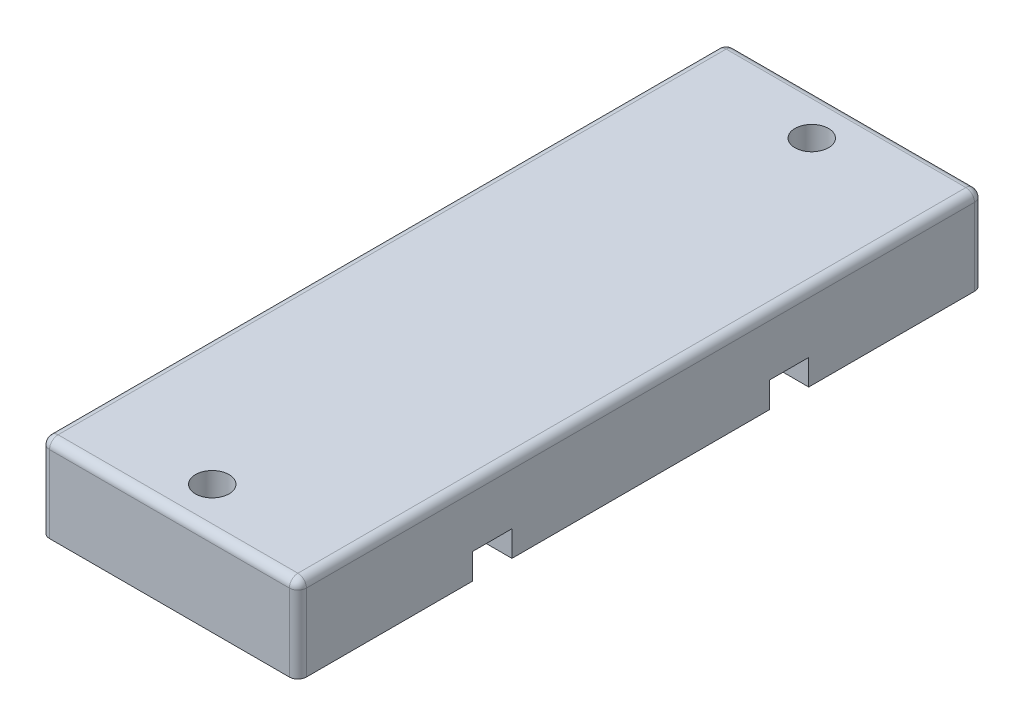
ISO-10303-21;
HEADER;
FILE_DESCRIPTION(('STEP AP214'),'2;1');
FILE_NAME('part.step','',(''),(''),'','','');
FILE_SCHEMA(('AUTOMOTIVE_DESIGN { 1 0 10303 214 1 1 1 1 }'));
ENDSEC;
DATA;
#1=APPLICATION_CONTEXT('core data for automotive mechanical design processes');
#2=APPLICATION_PROTOCOL_DEFINITION('international standard','automotive_design',2000,#1);
#3=PRODUCT_CONTEXT('',#1,'mechanical');
#4=PRODUCT('Part','Part','',(#3));
#5=PRODUCT_RELATED_PRODUCT_CATEGORY('part','',(#4));
#6=PRODUCT_DEFINITION_FORMATION('','',#4);
#7=PRODUCT_DEFINITION_CONTEXT('part definition',#1,'design');
#8=PRODUCT_DEFINITION('design','',#6,#7);
#9=PRODUCT_DEFINITION_SHAPE('','',#8);
#10=(LENGTH_UNIT() NAMED_UNIT(*) SI_UNIT(.MILLI.,.METRE.));
#11=(NAMED_UNIT(*) PLANE_ANGLE_UNIT() SI_UNIT($,.RADIAN.));
#12=(NAMED_UNIT(*) SI_UNIT($,.STERADIAN.) SOLID_ANGLE_UNIT());
#13=UNCERTAINTY_MEASURE_WITH_UNIT(LENGTH_MEASURE(1.E-05),#10,'distance_accuracy_value','');
#14=(GEOMETRIC_REPRESENTATION_CONTEXT(3) GLOBAL_UNCERTAINTY_ASSIGNED_CONTEXT((#13)) GLOBAL_UNIT_ASSIGNED_CONTEXT((#10,
#11,#12)) REPRESENTATION_CONTEXT('',''));
#15=CARTESIAN_POINT('',(0.,0.,0.));
#16=DIRECTION('',(0.,0.,1.));
#17=DIRECTION('',(1.,0.,0.));
#18=AXIS2_PLACEMENT_3D('',#15,#16,#17);
#19=CARTESIAN_POINT('',(0.,0.,0.));
#20=DIRECTION('',(0.,-1.,0.));
#21=DIRECTION('',(0.,0.,-1.));
#22=AXIS2_PLACEMENT_3D('',#19,#20,#21);
#23=PLANE('',#22);
#24=CARTESIAN_POINT('',(19.05,0.,-95.25));
#25=DIRECTION('',(0.,1.,0.));
#26=DIRECTION('',(0.,0.,1.));
#27=AXIS2_PLACEMENT_3D('',#24,#25,#26);
#28=CIRCLE('',#27,2.4892);
#29=CARTESIAN_POINT('',(19.05,0.,-92.7608));
#30=VERTEX_POINT('',#29);
#31=EDGE_CURVE('E482',#30,#30,#28,.T.);
#32=ORIENTED_EDGE('',*,*,#31,.T.);
#33=EDGE_LOOP('',(#32));
#34=FACE_BOUND('',#33,.T.);
#35=DIRECTION('',(-1.,0.,0.));
#36=VECTOR('',#35,1.);
#37=CARTESIAN_POINT('',(0.,0.,-101.6));
#38=LINE('',#37,#36);
#39=CARTESIAN_POINT('',(36.83,0.,-101.6));
#40=VERTEX_POINT('',#39);
#41=CARTESIAN_POINT('',(1.26999999999999,0.,-101.6));
#42=VERTEX_POINT('',#41);
#43=EDGE_CURVE('E265',#40,#42,#38,.T.);
#44=ORIENTED_EDGE('',*,*,#43,.F.);
#45=CARTESIAN_POINT('',(36.83,0.,-100.33));
#46=DIRECTION('',(0.,-1.,0.));
#47=DIRECTION('',(0.,0.,-1.));
#48=AXIS2_PLACEMENT_3D('',#45,#46,#47);
#49=CIRCLE('',#48,1.27);
#50=CARTESIAN_POINT('',(38.1,0.,-100.33));
#51=VERTEX_POINT('',#50);
#52=EDGE_CURVE('E287',#40,#51,#49,.T.);
#53=ORIENTED_EDGE('',*,*,#52,.T.);
#54=DIRECTION('',(0.,0.,-1.));
#55=VECTOR('',#54,1.);
#56=CARTESIAN_POINT('',(38.1,0.,-101.6));
#57=LINE('',#56,#55);
#58=CARTESIAN_POINT('',(38.1,0.,-75.753849));
#59=VERTEX_POINT('',#58);
#60=EDGE_CURVE('E261',#59,#51,#57,.T.);
#61=ORIENTED_EDGE('',*,*,#60,.F.);
#62=DIRECTION('',(-1.,0.,0.));
#63=VECTOR('',#62,1.);
#64=CARTESIAN_POINT('',(38.1,0.,-75.753849));
#65=LINE('',#64,#63);
#66=CARTESIAN_POINT('',(0.,0.,-75.753849));
#67=VERTEX_POINT('',#66);
#68=EDGE_CURVE('E215',#59,#67,#65,.T.);
#69=ORIENTED_EDGE('',*,*,#68,.T.);
#70=DIRECTION('',(0.,0.,1.));
#71=VECTOR('',#70,1.);
#72=CARTESIAN_POINT('',(0.,0.,0.));
#73=LINE('',#72,#71);
#74=CARTESIAN_POINT('',(0.,0.,-100.33));
#75=VERTEX_POINT('',#74);
#76=EDGE_CURVE('E270',#75,#67,#73,.T.);
#77=ORIENTED_EDGE('',*,*,#76,.F.);
#78=CARTESIAN_POINT('',(1.26999999999999,0.,-100.33));
#79=DIRECTION('',(0.,-1.,0.));
#80=DIRECTION('',(0.,0.,-1.));
#81=AXIS2_PLACEMENT_3D('',#78,#79,#80);
#82=CIRCLE('',#81,1.27);
#83=EDGE_CURVE('E284',#75,#42,#82,.T.);
#84=ORIENTED_EDGE('',*,*,#83,.T.);
#85=EDGE_LOOP('',(#44,#53,#61,#69,#77,#84));
#86=FACE_BOUND('',#85,.T.);
#87=ADVANCED_FACE('F43',(#34,#86),#23,.T.);
#88=DIRECTION('',(-1.,0.,0.));
#89=VECTOR('',#88,1.);
#90=CARTESIAN_POINT('',(38.1,0.,-69.9155828));
#91=LINE('',#90,#89);
#92=CARTESIAN_POINT('',(38.1,0.,-69.9155828));
#93=VERTEX_POINT('',#92);
#94=CARTESIAN_POINT('',(0.,0.,-69.9155828));
#95=VERTEX_POINT('',#94);
#96=EDGE_CURVE('E180',#93,#95,#91,.T.);
#97=ORIENTED_EDGE('',*,*,#96,.F.);
#98=CARTESIAN_POINT('',(38.1,0.,-31.7410338));
#99=VERTEX_POINT('',#98);
#100=EDGE_CURVE('E196',#99,#93,#57,.T.);
#101=ORIENTED_EDGE('',*,*,#100,.F.);
#102=DIRECTION('',(-1.,0.,0.));
#103=VECTOR('',#102,1.);
#104=CARTESIAN_POINT('',(38.1,0.,-31.7410338));
#105=LINE('',#104,#103);
#106=CARTESIAN_POINT('',(0.,0.,-31.7410338));
#107=VERTEX_POINT('',#106);
#108=EDGE_CURVE('E234',#99,#107,#105,.T.);
#109=ORIENTED_EDGE('',*,*,#108,.T.);
#110=EDGE_CURVE('E274',#95,#107,#73,.T.);
#111=ORIENTED_EDGE('',*,*,#110,.F.);
#112=EDGE_LOOP('',(#97,#101,#109,#111));
#113=FACE_BOUND('',#112,.T.);
#114=ADVANCED_FACE('F455',(#113),#23,.T.);
#115=CARTESIAN_POINT('',(38.1,12.7,0.));
#116=DIRECTION('',(0.,0.,-1.));
#117=DIRECTION('',(-1.,0.,0.));
#118=AXIS2_PLACEMENT_3D('',#115,#116,#117);
#119=PLANE('',#118);
#120=DIRECTION('',(1.,0.,0.));
#121=VECTOR('',#120,1.);
#122=CARTESIAN_POINT('',(38.1,0.,0.));
#123=LINE('',#122,#121);
#124=CARTESIAN_POINT('',(1.27,0.,0.));
#125=VERTEX_POINT('',#124);
#126=CARTESIAN_POINT('',(36.83,0.,0.));
#127=VERTEX_POINT('',#126);
#128=EDGE_CURVE('E219',#125,#127,#123,.T.);
#129=ORIENTED_EDGE('',*,*,#128,.T.);
#130=DIRECTION('',(0.,-1.,0.));
#131=VECTOR('',#130,1.);
#132=CARTESIAN_POINT('',(36.83,12.7,0.));
#133=LINE('',#132,#131);
#134=CARTESIAN_POINT('',(36.83,11.43,0.));
#135=VERTEX_POINT('',#134);
#136=EDGE_CURVE('E324',#127,#135,#133,.F.);
#137=ORIENTED_EDGE('',*,*,#136,.T.);
#138=DIRECTION('',(1.,0.,0.));
#139=VECTOR('',#138,1.);
#140=CARTESIAN_POINT('',(38.1,11.43,0.));
#141=LINE('',#140,#139);
#142=CARTESIAN_POINT('',(1.27,11.43,0.));
#143=VERTEX_POINT('',#142);
#144=EDGE_CURVE('E321',#135,#143,#141,.F.);
#145=ORIENTED_EDGE('',*,*,#144,.T.);
#146=DIRECTION('',(0.,-1.,0.));
#147=VECTOR('',#146,1.);
#148=CARTESIAN_POINT('',(1.27,12.7,0.));
#149=LINE('',#148,#147);
#150=EDGE_CURVE('E318',#143,#125,#149,.T.);
#151=ORIENTED_EDGE('',*,*,#150,.T.);
#152=EDGE_LOOP('',(#129,#137,#145,#151));
#153=FACE_BOUND('',#152,.T.);
#154=ADVANCED_FACE('F387',(#153),#119,.F.);
#155=CARTESIAN_POINT('',(38.1,12.7,-101.6));
#156=DIRECTION('',(-1.,0.,0.));
#157=DIRECTION('',(0.,0.,1.));
#158=AXIS2_PLACEMENT_3D('',#155,#156,#157);
#159=PLANE('',#158);
#160=ORIENTED_EDGE('',*,*,#60,.T.);
#161=DIRECTION('',(0.,-1.,0.));
#162=VECTOR('',#161,1.);
#163=CARTESIAN_POINT('',(38.1,12.7,-100.33));
#164=LINE('',#163,#162);
#165=CARTESIAN_POINT('',(38.1,11.43,-100.33));
#166=VERTEX_POINT('',#165);
#167=EDGE_CURVE('E296',#51,#166,#164,.F.);
#168=ORIENTED_EDGE('',*,*,#167,.T.);
#169=DIRECTION('',(0.,0.,-1.));
#170=VECTOR('',#169,1.);
#171=CARTESIAN_POINT('',(38.1,11.43,-101.6));
#172=LINE('',#171,#170);
#173=CARTESIAN_POINT('',(38.1,11.43,-1.27000000000001));
#174=VERTEX_POINT('',#173);
#175=EDGE_CURVE('E293',#166,#174,#172,.F.);
#176=ORIENTED_EDGE('',*,*,#175,.T.);
#177=DIRECTION('',(0.,-1.,0.));
#178=VECTOR('',#177,1.);
#179=CARTESIAN_POINT('',(38.1,12.7,-1.27000000000001));
#180=LINE('',#179,#178);
#181=CARTESIAN_POINT('',(38.1,0.,-1.27000000000001));
#182=VERTEX_POINT('',#181);
#183=EDGE_CURVE('E290',#174,#182,#180,.T.);
#184=ORIENTED_EDGE('',*,*,#183,.T.);
#185=CARTESIAN_POINT('',(38.1,0.,-25.9027676));
#186=VERTEX_POINT('',#185);
#187=EDGE_CURVE('E262',#182,#186,#57,.T.);
#188=ORIENTED_EDGE('',*,*,#187,.T.);
#189=DIRECTION('',(0.,1.,0.));
#190=VECTOR('',#189,1.);
#191=CARTESIAN_POINT('',(38.1,3.81,-25.9027676));
#192=LINE('',#191,#190);
#193=CARTESIAN_POINT('',(38.1,3.81,-25.9027676));
#194=VERTEX_POINT('',#193);
#195=EDGE_CURVE('E242',#186,#194,#192,.T.);
#196=ORIENTED_EDGE('',*,*,#195,.T.);
#197=DIRECTION('',(0.,0.,-1.));
#198=VECTOR('',#197,1.);
#199=CARTESIAN_POINT('',(38.1,3.81,-31.7410338));
#200=LINE('',#199,#198);
#201=CARTESIAN_POINT('',(38.1,3.81,-31.7410338));
#202=VERTEX_POINT('',#201);
#203=EDGE_CURVE('E251',#194,#202,#200,.T.);
#204=ORIENTED_EDGE('',*,*,#203,.T.);
#205=DIRECTION('',(0.,-1.,0.));
#206=VECTOR('',#205,1.);
#207=CARTESIAN_POINT('',(38.1,0.,-31.7410338));
#208=LINE('',#207,#206);
#209=EDGE_CURVE('E227',#202,#99,#208,.T.);
#210=ORIENTED_EDGE('',*,*,#209,.T.);
#211=ORIENTED_EDGE('',*,*,#100,.T.);
#212=DIRECTION('',(0.,1.,0.));
#213=VECTOR('',#212,1.);
#214=CARTESIAN_POINT('',(38.1,3.81,-69.9155828));
#215=LINE('',#214,#213);
#216=CARTESIAN_POINT('',(38.1,3.81,-69.9155828));
#217=VERTEX_POINT('',#216);
#218=EDGE_CURVE('E171',#93,#217,#215,.T.);
#219=ORIENTED_EDGE('',*,*,#218,.T.);
#220=DIRECTION('',(0.,0.,-1.));
#221=VECTOR('',#220,1.);
#222=CARTESIAN_POINT('',(38.1,3.81,-75.753849));
#223=LINE('',#222,#221);
#224=CARTESIAN_POINT('',(38.1,3.81,-75.753849));
#225=VERTEX_POINT('',#224);
#226=EDGE_CURVE('E183',#217,#225,#223,.T.);
#227=ORIENTED_EDGE('',*,*,#226,.T.);
#228=DIRECTION('',(0.,-1.,0.));
#229=VECTOR('',#228,1.);
#230=CARTESIAN_POINT('',(38.1,0.,-75.753849));
#231=LINE('',#230,#229);
#232=EDGE_CURVE('E189',#225,#59,#231,.T.);
#233=ORIENTED_EDGE('',*,*,#232,.T.);
#234=EDGE_LOOP('',(#160,#168,#176,#184,#188,#196,#204,#210,#211,#219,#227,#233));
#235=FACE_BOUND('',#234,.T.);
#236=ADVANCED_FACE('F193',(#235),#159,.F.);
#237=CARTESIAN_POINT('',(0.,12.7,-101.6));
#238=DIRECTION('',(0.,0.,1.));
#239=DIRECTION('',(1.,0.,0.));
#240=AXIS2_PLACEMENT_3D('',#237,#238,#239);
#241=PLANE('',#240);
#242=DIRECTION('',(-1.,0.,0.));
#243=VECTOR('',#242,1.);
#244=CARTESIAN_POINT('',(0.,11.43,-101.6));
#245=LINE('',#244,#243);
#246=CARTESIAN_POINT('',(1.26999999999999,11.43,-101.6));
#247=VERTEX_POINT('',#246);
#248=CARTESIAN_POINT('',(36.83,11.43,-101.6));
#249=VERTEX_POINT('',#248);
#250=EDGE_CURVE('E277',#247,#249,#245,.F.);
#251=ORIENTED_EDGE('',*,*,#250,.T.);
#252=DIRECTION('',(0.,-1.,0.));
#253=VECTOR('',#252,1.);
#254=CARTESIAN_POINT('',(36.83,12.7,-101.6));
#255=LINE('',#254,#253);
#256=EDGE_CURVE('E280',#249,#40,#255,.T.);
#257=ORIENTED_EDGE('',*,*,#256,.T.);
#258=ORIENTED_EDGE('',*,*,#43,.T.);
#259=DIRECTION('',(0.,-1.,0.));
#260=VECTOR('',#259,1.);
#261=CARTESIAN_POINT('',(1.26999999999999,12.7,-101.6));
#262=LINE('',#261,#260);
#263=EDGE_CURVE('E273',#42,#247,#262,.F.);
#264=ORIENTED_EDGE('',*,*,#263,.T.);
#265=EDGE_LOOP('',(#251,#257,#258,#264));
#266=FACE_BOUND('',#265,.T.);
#267=ADVANCED_FACE('F445',(#266),#241,.F.);
#268=CARTESIAN_POINT('',(0.,12.7,0.));
#269=DIRECTION('',(1.,0.,0.));
#270=DIRECTION('',(0.,0.,-1.));
#271=AXIS2_PLACEMENT_3D('',#268,#269,#270);
#272=PLANE('',#271);
#273=CARTESIAN_POINT('',(0.,0.,-25.9027676));
#274=VERTEX_POINT('',#273);
#275=CARTESIAN_POINT('',(0.,0.,-1.27));
#276=VERTEX_POINT('',#275);
#277=EDGE_CURVE('E269',#274,#276,#73,.T.);
#278=ORIENTED_EDGE('',*,*,#277,.T.);
#279=DIRECTION('',(0.,-1.,0.));
#280=VECTOR('',#279,1.);
#281=CARTESIAN_POINT('',(0.,12.7,-1.27));
#282=LINE('',#281,#280);
#283=CARTESIAN_POINT('',(0.,11.43,-1.27));
#284=VERTEX_POINT('',#283);
#285=EDGE_CURVE('E11',#276,#284,#282,.F.);
#286=ORIENTED_EDGE('',*,*,#285,.T.);
#287=DIRECTION('',(0.,0.,1.));
#288=VECTOR('',#287,1.);
#289=CARTESIAN_POINT('',(0.,11.43,0.));
#290=LINE('',#289,#288);
#291=CARTESIAN_POINT('',(0.,11.43,-100.33));
#292=VERTEX_POINT('',#291);
#293=EDGE_CURVE('E53',#284,#292,#290,.F.);
#294=ORIENTED_EDGE('',*,*,#293,.T.);
#295=DIRECTION('',(0.,-1.,0.));
#296=VECTOR('',#295,1.);
#297=CARTESIAN_POINT('',(0.,12.7,-100.33));
#298=LINE('',#297,#296);
#299=EDGE_CURVE('E327',#292,#75,#298,.T.);
#300=ORIENTED_EDGE('',*,*,#299,.T.);
#301=ORIENTED_EDGE('',*,*,#76,.T.);
#302=DIRECTION('',(0.,-1.,0.));
#303=VECTOR('',#302,1.);
#304=CARTESIAN_POINT('',(0.,0.,-75.753849));
#305=LINE('',#304,#303);
#306=CARTESIAN_POINT('',(0.,3.81,-75.753849));
#307=VERTEX_POINT('',#306);
#308=EDGE_CURVE('E198',#307,#67,#305,.T.);
#309=ORIENTED_EDGE('',*,*,#308,.F.);
#310=DIRECTION('',(0.,0.,-1.));
#311=VECTOR('',#310,1.);
#312=CARTESIAN_POINT('',(0.,3.81,-75.753849));
#313=LINE('',#312,#311);
#314=CARTESIAN_POINT('',(0.,3.81,-69.9155828));
#315=VERTEX_POINT('',#314);
#316=EDGE_CURVE('E202',#315,#307,#313,.T.);
#317=ORIENTED_EDGE('',*,*,#316,.F.);
#318=DIRECTION('',(0.,1.,0.));
#319=VECTOR('',#318,1.);
#320=CARTESIAN_POINT('',(0.,3.81,-69.9155828));
#321=LINE('',#320,#319);
#322=EDGE_CURVE('E174',#95,#315,#321,.T.);
#323=ORIENTED_EDGE('',*,*,#322,.F.);
#324=ORIENTED_EDGE('',*,*,#110,.T.);
#325=DIRECTION('',(0.,-1.,0.));
#326=VECTOR('',#325,1.);
#327=CARTESIAN_POINT('',(0.,0.,-31.7410338));
#328=LINE('',#327,#326);
#329=CARTESIAN_POINT('',(0.,3.81,-31.7410338));
#330=VERTEX_POINT('',#329);
#331=EDGE_CURVE('E238',#330,#107,#328,.T.);
#332=ORIENTED_EDGE('',*,*,#331,.F.);
#333=DIRECTION('',(0.,0.,-1.));
#334=VECTOR('',#333,1.);
#335=CARTESIAN_POINT('',(0.,3.81,-31.7410338));
#336=LINE('',#335,#334);
#337=CARTESIAN_POINT('',(0.,3.81,-25.9027676));
#338=VERTEX_POINT('',#337);
#339=EDGE_CURVE('E241',#338,#330,#336,.T.);
#340=ORIENTED_EDGE('',*,*,#339,.F.);
#341=DIRECTION('',(0.,1.,0.));
#342=VECTOR('',#341,1.);
#343=CARTESIAN_POINT('',(0.,3.81,-25.9027676));
#344=LINE('',#343,#342);
#345=EDGE_CURVE('E212',#274,#338,#344,.T.);
#346=ORIENTED_EDGE('',*,*,#345,.F.);
#347=EDGE_LOOP('',(#278,#286,#294,#300,#301,#309,#317,#323,#324,#332,#340,#346));
#348=FACE_BOUND('',#347,.T.);
#349=ADVANCED_FACE('F426',(#348),#272,.F.);
#350=CARTESIAN_POINT('',(0.,12.7,0.));
#351=DIRECTION('',(0.,-1.,0.));
#352=DIRECTION('',(0.,0.,-1.));
#353=AXIS2_PLACEMENT_3D('',#350,#351,#352);
#354=PLANE('',#353);
#355=CARTESIAN_POINT('',(19.05,12.7,-95.25));
#356=DIRECTION('',(0.,1.,0.));
#357=DIRECTION('',(0.,0.,1.));
#358=AXIS2_PLACEMENT_3D('',#355,#356,#357);
#359=CIRCLE('',#358,2.4892);
#360=CARTESIAN_POINT('',(19.05,12.7,-92.7608));
#361=VERTEX_POINT('',#360);
#362=EDGE_CURVE('E486',#361,#361,#359,.T.);
#363=ORIENTED_EDGE('',*,*,#362,.F.);
#364=EDGE_LOOP('',(#363));
#365=FACE_BOUND('',#364,.T.);
#366=CARTESIAN_POINT('',(19.05,12.7,-6.35));
#367=DIRECTION('',(0.,1.,0.));
#368=DIRECTION('',(0.,0.,1.));
#369=AXIS2_PLACEMENT_3D('',#366,#367,#368);
#370=CIRCLE('',#369,2.4892);
#371=CARTESIAN_POINT('',(19.05,12.7,-3.8608));
#372=VERTEX_POINT('',#371);
#373=EDGE_CURVE('E479',#372,#372,#370,.T.);
#374=ORIENTED_EDGE('',*,*,#373,.F.);
#375=EDGE_LOOP('',(#374));
#376=FACE_BOUND('',#375,.T.);
#377=DIRECTION('',(1.,0.,0.));
#378=VECTOR('',#377,1.);
#379=CARTESIAN_POINT('',(0.,12.7,-1.27));
#380=LINE('',#379,#378);
#381=CARTESIAN_POINT('',(1.27,12.7,-1.27));
#382=VERTEX_POINT('',#381);
#383=CARTESIAN_POINT('',(36.83,12.7,-1.27000000000001));
#384=VERTEX_POINT('',#383);
#385=EDGE_CURVE('E305',#382,#384,#380,.T.);
#386=ORIENTED_EDGE('',*,*,#385,.T.);
#387=DIRECTION('',(0.,0.,-1.));
#388=VECTOR('',#387,1.);
#389=CARTESIAN_POINT('',(36.83,12.7,0.));
#390=LINE('',#389,#388);
#391=CARTESIAN_POINT('',(36.83,12.7,-100.33));
#392=VERTEX_POINT('',#391);
#393=EDGE_CURVE('E308',#384,#392,#390,.T.);
#394=ORIENTED_EDGE('',*,*,#393,.T.);
#395=DIRECTION('',(-1.,0.,0.));
#396=VECTOR('',#395,1.);
#397=CARTESIAN_POINT('',(0.,12.7,-100.33));
#398=LINE('',#397,#396);
#399=CARTESIAN_POINT('',(1.26999999999999,12.7,-100.33));
#400=VERTEX_POINT('',#399);
#401=EDGE_CURVE('E302',#392,#400,#398,.T.);
#402=ORIENTED_EDGE('',*,*,#401,.T.);
#403=DIRECTION('',(0.,0.,1.));
#404=VECTOR('',#403,1.);
#405=CARTESIAN_POINT('',(1.27,12.7,0.));
#406=LINE('',#405,#404);
#407=EDGE_CURVE('E299',#400,#382,#406,.T.);
#408=ORIENTED_EDGE('',*,*,#407,.T.);
#409=EDGE_LOOP('',(#386,#394,#402,#408));
#410=FACE_BOUND('',#409,.T.);
#411=ADVANCED_FACE('F411',(#365,#376,#410),#354,.F.);
#412=CARTESIAN_POINT('',(19.05,0.,-6.35));
#413=DIRECTION('',(0.,1.,0.));
#414=DIRECTION('',(0.,0.,1.));
#415=AXIS2_PLACEMENT_3D('',#412,#413,#414);
#416=CIRCLE('',#415,2.4892);
#417=CARTESIAN_POINT('',(19.05,0.,-3.8608));
#418=VERTEX_POINT('',#417);
#419=EDGE_CURVE('E205',#418,#418,#416,.T.);
#420=ORIENTED_EDGE('',*,*,#419,.T.);
#421=EDGE_LOOP('',(#420));
#422=FACE_BOUND('',#421,.T.);
#423=ORIENTED_EDGE('',*,*,#187,.F.);
#424=CARTESIAN_POINT('',(36.83,0.,-1.27000000000001));
#425=DIRECTION('',(0.,-1.,0.));
#426=DIRECTION('',(0.,0.,-1.));
#427=AXIS2_PLACEMENT_3D('',#424,#425,#426);
#428=CIRCLE('',#427,1.27);
#429=EDGE_CURVE('E315',#182,#127,#428,.T.);
#430=ORIENTED_EDGE('',*,*,#429,.T.);
#431=ORIENTED_EDGE('',*,*,#128,.F.);
#432=CARTESIAN_POINT('',(1.27,0.,-1.27));
#433=DIRECTION('',(0.,-1.,0.));
#434=DIRECTION('',(0.,0.,-1.));
#435=AXIS2_PLACEMENT_3D('',#432,#433,#434);
#436=CIRCLE('',#435,1.27);
#437=EDGE_CURVE('E312',#125,#276,#436,.T.);
#438=ORIENTED_EDGE('',*,*,#437,.T.);
#439=ORIENTED_EDGE('',*,*,#277,.F.);
#440=DIRECTION('',(-1.,0.,0.));
#441=VECTOR('',#440,1.);
#442=CARTESIAN_POINT('',(38.1,0.,-25.9027676));
#443=LINE('',#442,#441);
#444=EDGE_CURVE('E224',#186,#274,#443,.T.);
#445=ORIENTED_EDGE('',*,*,#444,.F.);
#446=EDGE_LOOP('',(#423,#430,#431,#438,#439,#445));
#447=FACE_BOUND('',#446,.T.);
#448=ADVANCED_FACE('F391',(#422,#447),#23,.T.);
#449=CARTESIAN_POINT('',(38.1,0.,-31.7410338));
#450=DIRECTION('',(0.,0.,-1.));
#451=DIRECTION('',(-1.,0.,0.));
#452=AXIS2_PLACEMENT_3D('',#449,#450,#451);
#453=PLANE('',#452);
#454=ORIENTED_EDGE('',*,*,#331,.T.);
#455=ORIENTED_EDGE('',*,*,#108,.F.);
#456=ORIENTED_EDGE('',*,*,#209,.F.);
#457=DIRECTION('',(-1.,0.,0.));
#458=VECTOR('',#457,1.);
#459=CARTESIAN_POINT('',(38.1,3.81,-31.7410338));
#460=LINE('',#459,#458);
#461=EDGE_CURVE('E231',#202,#330,#460,.T.);
#462=ORIENTED_EDGE('',*,*,#461,.T.);
#463=EDGE_LOOP('',(#454,#455,#456,#462));
#464=FACE_BOUND('',#463,.T.);
#465=ADVANCED_FACE('F465',(#464),#453,.F.);
#466=CARTESIAN_POINT('',(38.1,3.81,-31.7410338));
#467=DIRECTION('',(0.,1.,0.));
#468=DIRECTION('',(0.,0.,1.));
#469=AXIS2_PLACEMENT_3D('',#466,#467,#468);
#470=PLANE('',#469);
#471=ORIENTED_EDGE('',*,*,#339,.T.);
#472=ORIENTED_EDGE('',*,*,#461,.F.);
#473=ORIENTED_EDGE('',*,*,#203,.F.);
#474=DIRECTION('',(-1.,0.,0.));
#475=VECTOR('',#474,1.);
#476=CARTESIAN_POINT('',(38.1,3.81,-25.9027676));
#477=LINE('',#476,#475);
#478=EDGE_CURVE('E228',#194,#338,#477,.T.);
#479=ORIENTED_EDGE('',*,*,#478,.T.);
#480=EDGE_LOOP('',(#471,#472,#473,#479));
#481=FACE_BOUND('',#480,.T.);
#482=ADVANCED_FACE('F471',(#481),#470,.F.);
#483=CARTESIAN_POINT('',(38.1,3.81,-25.9027676));
#484=DIRECTION('',(0.,0.,1.));
#485=DIRECTION('',(1.,0.,0.));
#486=AXIS2_PLACEMENT_3D('',#483,#484,#485);
#487=PLANE('',#486);
#488=ORIENTED_EDGE('',*,*,#345,.T.);
#489=ORIENTED_EDGE('',*,*,#478,.F.);
#490=ORIENTED_EDGE('',*,*,#195,.F.);
#491=ORIENTED_EDGE('',*,*,#444,.T.);
#492=EDGE_LOOP('',(#488,#489,#490,#491));
#493=FACE_BOUND('',#492,.T.);
#494=ADVANCED_FACE('F507',(#493),#487,.F.);
#495=CARTESIAN_POINT('',(38.1,0.,-75.753849));
#496=DIRECTION('',(0.,0.,-1.));
#497=DIRECTION('',(-1.,0.,0.));
#498=AXIS2_PLACEMENT_3D('',#495,#496,#497);
#499=PLANE('',#498);
#500=ORIENTED_EDGE('',*,*,#308,.T.);
#501=ORIENTED_EDGE('',*,*,#68,.F.);
#502=ORIENTED_EDGE('',*,*,#232,.F.);
#503=DIRECTION('',(-1.,0.,0.));
#504=VECTOR('',#503,1.);
#505=CARTESIAN_POINT('',(38.1,3.81,-75.753849));
#506=LINE('',#505,#504);
#507=EDGE_CURVE('E179',#225,#307,#506,.T.);
#508=ORIENTED_EDGE('',*,*,#507,.T.);
#509=EDGE_LOOP('',(#500,#501,#502,#508));
#510=FACE_BOUND('',#509,.T.);
#511=ADVANCED_FACE('F432',(#510),#499,.F.);
#512=CARTESIAN_POINT('',(38.1,3.81,-75.753849));
#513=DIRECTION('',(0.,1.,0.));
#514=DIRECTION('',(0.,0.,1.));
#515=AXIS2_PLACEMENT_3D('',#512,#513,#514);
#516=PLANE('',#515);
#517=ORIENTED_EDGE('',*,*,#316,.T.);
#518=ORIENTED_EDGE('',*,*,#507,.F.);
#519=ORIENTED_EDGE('',*,*,#226,.F.);
#520=DIRECTION('',(-1.,0.,0.));
#521=VECTOR('',#520,1.);
#522=CARTESIAN_POINT('',(38.1,3.81,-69.9155828));
#523=LINE('',#522,#521);
#524=EDGE_CURVE('E167',#217,#315,#523,.T.);
#525=ORIENTED_EDGE('',*,*,#524,.T.);
#526=EDGE_LOOP('',(#517,#518,#519,#525));
#527=FACE_BOUND('',#526,.T.);
#528=ADVANCED_FACE('F184',(#527),#516,.F.);
#529=CARTESIAN_POINT('',(38.1,3.81,-69.9155828));
#530=DIRECTION('',(0.,0.,1.));
#531=DIRECTION('',(1.,0.,0.));
#532=AXIS2_PLACEMENT_3D('',#529,#530,#531);
#533=PLANE('',#532);
#534=ORIENTED_EDGE('',*,*,#322,.T.);
#535=ORIENTED_EDGE('',*,*,#524,.F.);
#536=ORIENTED_EDGE('',*,*,#218,.F.);
#537=ORIENTED_EDGE('',*,*,#96,.T.);
#538=EDGE_LOOP('',(#534,#535,#536,#537));
#539=FACE_BOUND('',#538,.T.);
#540=ADVANCED_FACE('F169',(#539),#533,.F.);
#541=CARTESIAN_POINT('',(1.27,12.7,-1.27));
#542=DIRECTION('',(0.,-1.,0.));
#543=DIRECTION('',(0.,0.,-1.));
#544=AXIS2_PLACEMENT_3D('',#541,#542,#543);
#545=CYLINDRICAL_SURFACE('',#544,1.27);
#546=CARTESIAN_POINT('',(1.27,11.43,-1.27));
#547=DIRECTION('',(0.,1.,0.));
#548=DIRECTION('',(0.,0.,1.));
#549=AXIS2_PLACEMENT_3D('',#546,#547,#548);
#550=CIRCLE('',#549,1.27);
#551=EDGE_CURVE('E47',#284,#143,#550,.T.);
#552=ORIENTED_EDGE('',*,*,#551,.F.);
#553=ORIENTED_EDGE('',*,*,#285,.F.);
#554=ORIENTED_EDGE('',*,*,#437,.F.);
#555=ORIENTED_EDGE('',*,*,#150,.F.);
#556=EDGE_LOOP('',(#552,#553,#554,#555));
#557=FACE_BOUND('',#556,.T.);
#558=ADVANCED_FACE('F45',(#557),#545,.T.);
#559=CARTESIAN_POINT('',(1.27,11.43,-1.27));
#560=DIRECTION('',(0.,0.,1.));
#561=DIRECTION('',(1.,0.,0.));
#562=AXIS2_PLACEMENT_3D('',#559,#560,#561);
#563=SPHERICAL_SURFACE('',#562,1.27);
#564=CARTESIAN_POINT('',(1.27,11.43,-1.27));
#565=DIRECTION('',(0.,0.,1.));
#566=DIRECTION('',(1.,0.,0.));
#567=AXIS2_PLACEMENT_3D('',#564,#565,#566);
#568=CIRCLE('',#567,1.27);
#569=EDGE_CURVE('E367',#284,#382,#568,.F.);
#570=ORIENTED_EDGE('',*,*,#569,.F.);
#571=ORIENTED_EDGE('',*,*,#551,.T.);
#572=CARTESIAN_POINT('',(1.27,11.43,-1.27));
#573=DIRECTION('',(-1.,0.,0.));
#574=DIRECTION('',(0.,0.,1.));
#575=AXIS2_PLACEMENT_3D('',#572,#573,#574);
#576=CIRCLE('',#575,1.27);
#577=EDGE_CURVE('E370',#382,#143,#576,.F.);
#578=ORIENTED_EDGE('',*,*,#577,.F.);
#579=EDGE_LOOP('',(#570,#571,#578));
#580=FACE_BOUND('',#579,.T.);
#581=ADVANCED_FACE('F381',(#580),#563,.T.);
#582=CARTESIAN_POINT('',(36.83,12.7,-1.27000000000001));
#583=DIRECTION('',(0.,-1.,0.));
#584=DIRECTION('',(0.,0.,-1.));
#585=AXIS2_PLACEMENT_3D('',#582,#583,#584);
#586=CYLINDRICAL_SURFACE('',#585,1.27);
#587=ORIENTED_EDGE('',*,*,#429,.F.);
#588=ORIENTED_EDGE('',*,*,#183,.F.);
#589=CARTESIAN_POINT('',(36.83,11.43,-1.27000000000001));
#590=DIRECTION('',(0.,1.,0.));
#591=DIRECTION('',(0.,0.,1.));
#592=AXIS2_PLACEMENT_3D('',#589,#590,#591);
#593=CIRCLE('',#592,1.27);
#594=EDGE_CURVE('E363',#135,#174,#593,.T.);
#595=ORIENTED_EDGE('',*,*,#594,.F.);
#596=ORIENTED_EDGE('',*,*,#136,.F.);
#597=EDGE_LOOP('',(#587,#588,#595,#596));
#598=FACE_BOUND('',#597,.T.);
#599=ADVANCED_FACE('F397',(#598),#586,.T.);
#600=CARTESIAN_POINT('',(0.,11.43,-1.27));
#601=DIRECTION('',(1.,0.,0.));
#602=DIRECTION('',(0.,0.,-1.));
#603=AXIS2_PLACEMENT_3D('',#600,#601,#602);
#604=CYLINDRICAL_SURFACE('',#603,1.27);
#605=ORIENTED_EDGE('',*,*,#577,.T.);
#606=ORIENTED_EDGE('',*,*,#144,.F.);
#607=CARTESIAN_POINT('',(36.83,11.43,-1.27000000000001));
#608=DIRECTION('',(1.,0.,0.));
#609=DIRECTION('',(0.,0.,-1.));
#610=AXIS2_PLACEMENT_3D('',#607,#608,#609);
#611=CIRCLE('',#610,1.27);
#612=EDGE_CURVE('E359',#384,#135,#611,.T.);
#613=ORIENTED_EDGE('',*,*,#612,.F.);
#614=ORIENTED_EDGE('',*,*,#385,.F.);
#615=EDGE_LOOP('',(#605,#606,#613,#614));
#616=FACE_BOUND('',#615,.T.);
#617=ADVANCED_FACE('F400',(#616),#604,.T.);
#618=CARTESIAN_POINT('',(1.27,11.43,0.));
#619=DIRECTION('',(0.,0.,1.));
#620=DIRECTION('',(1.,0.,0.));
#621=AXIS2_PLACEMENT_3D('',#618,#619,#620);
#622=CYLINDRICAL_SURFACE('',#621,1.27);
#623=ORIENTED_EDGE('',*,*,#569,.T.);
#624=ORIENTED_EDGE('',*,*,#407,.F.);
#625=CARTESIAN_POINT('',(1.26999999999999,11.43,-100.33));
#626=DIRECTION('',(0.,0.,-1.));
#627=DIRECTION('',(-1.,0.,0.));
#628=AXIS2_PLACEMENT_3D('',#625,#626,#627);
#629=CIRCLE('',#628,1.27);
#630=EDGE_CURVE('E355',#292,#400,#629,.T.);
#631=ORIENTED_EDGE('',*,*,#630,.F.);
#632=ORIENTED_EDGE('',*,*,#293,.F.);
#633=EDGE_LOOP('',(#623,#624,#631,#632));
#634=FACE_BOUND('',#633,.T.);
#635=ADVANCED_FACE('F415',(#634),#622,.T.);
#636=CARTESIAN_POINT('',(1.26999999999999,12.7,-100.33));
#637=DIRECTION('',(0.,-1.,0.));
#638=DIRECTION('',(0.,0.,-1.));
#639=AXIS2_PLACEMENT_3D('',#636,#637,#638);
#640=CYLINDRICAL_SURFACE('',#639,1.27);
#641=ORIENTED_EDGE('',*,*,#83,.F.);
#642=ORIENTED_EDGE('',*,*,#299,.F.);
#643=CARTESIAN_POINT('',(1.26999999999999,11.43,-100.33));
#644=DIRECTION('',(0.,1.,0.));
#645=DIRECTION('',(0.,0.,1.));
#646=AXIS2_PLACEMENT_3D('',#643,#644,#645);
#647=CIRCLE('',#646,1.27);
#648=EDGE_CURVE('E351',#247,#292,#647,.T.);
#649=ORIENTED_EDGE('',*,*,#648,.F.);
#650=ORIENTED_EDGE('',*,*,#263,.F.);
#651=EDGE_LOOP('',(#641,#642,#649,#650));
#652=FACE_BOUND('',#651,.T.);
#653=ADVANCED_FACE('F424',(#652),#640,.T.);
#654=CARTESIAN_POINT('',(36.83,11.43,-1.27000000000001));
#655=DIRECTION('',(0.,0.,1.));
#656=DIRECTION('',(1.,0.,0.));
#657=AXIS2_PLACEMENT_3D('',#654,#655,#656);
#658=SPHERICAL_SURFACE('',#657,1.27);
#659=ORIENTED_EDGE('',*,*,#612,.T.);
#660=ORIENTED_EDGE('',*,*,#594,.T.);
#661=CARTESIAN_POINT('',(36.83,11.43,-1.27000000000001));
#662=DIRECTION('',(0.,0.,1.));
#663=DIRECTION('',(0.,-1.,0.));
#664=AXIS2_PLACEMENT_3D('',#661,#662,#663);
#665=CIRCLE('',#664,1.27);
#666=EDGE_CURVE('E347',#384,#174,#665,.F.);
#667=ORIENTED_EDGE('',*,*,#666,.F.);
#668=EDGE_LOOP('',(#659,#660,#667));
#669=FACE_BOUND('',#668,.T.);
#670=ADVANCED_FACE('F404',(#669),#658,.T.);
#671=CARTESIAN_POINT('',(1.26999999999999,11.43,-100.33));
#672=DIRECTION('',(-1.,0.,0.));
#673=DIRECTION('',(0.,0.,1.));
#674=AXIS2_PLACEMENT_3D('',#671,#672,#673);
#675=SPHERICAL_SURFACE('',#674,1.27);
#676=ORIENTED_EDGE('',*,*,#648,.T.);
#677=ORIENTED_EDGE('',*,*,#630,.T.);
#678=CARTESIAN_POINT('',(1.26999999999999,11.43,-100.33));
#679=DIRECTION('',(-1.,0.,0.));
#680=DIRECTION('',(0.,0.,1.));
#681=AXIS2_PLACEMENT_3D('',#678,#679,#680);
#682=CIRCLE('',#681,1.27);
#683=EDGE_CURVE('E343',#247,#400,#682,.F.);
#684=ORIENTED_EDGE('',*,*,#683,.F.);
#685=EDGE_LOOP('',(#676,#677,#684));
#686=FACE_BOUND('',#685,.T.);
#687=ADVANCED_FACE('F419',(#686),#675,.T.);
#688=CARTESIAN_POINT('',(36.83,11.43,0.));
#689=DIRECTION('',(0.,0.,-1.));
#690=DIRECTION('',(-1.,0.,0.));
#691=AXIS2_PLACEMENT_3D('',#688,#689,#690);
#692=CYLINDRICAL_SURFACE('',#691,1.27);
#693=ORIENTED_EDGE('',*,*,#666,.T.);
#694=ORIENTED_EDGE('',*,*,#175,.F.);
#695=CARTESIAN_POINT('',(36.83,11.43,-100.33));
#696=DIRECTION('',(0.,0.,-1.));
#697=DIRECTION('',(-1.,0.,0.));
#698=AXIS2_PLACEMENT_3D('',#695,#696,#697);
#699=CIRCLE('',#698,1.27);
#700=EDGE_CURVE('E339',#392,#166,#699,.T.);
#701=ORIENTED_EDGE('',*,*,#700,.F.);
#702=ORIENTED_EDGE('',*,*,#393,.F.);
#703=EDGE_LOOP('',(#693,#694,#701,#702));
#704=FACE_BOUND('',#703,.T.);
#705=ADVANCED_FACE('F408',(#704),#692,.T.);
#706=CARTESIAN_POINT('',(0.,11.43,-100.33));
#707=DIRECTION('',(-1.,0.,0.));
#708=DIRECTION('',(0.,0.,1.));
#709=AXIS2_PLACEMENT_3D('',#706,#707,#708);
#710=CYLINDRICAL_SURFACE('',#709,1.27);
#711=ORIENTED_EDGE('',*,*,#683,.T.);
#712=ORIENTED_EDGE('',*,*,#401,.F.);
#713=CARTESIAN_POINT('',(36.83,11.43,-100.33));
#714=DIRECTION('',(1.,0.,0.));
#715=DIRECTION('',(0.,0.,-1.));
#716=AXIS2_PLACEMENT_3D('',#713,#714,#715);
#717=CIRCLE('',#716,1.27);
#718=EDGE_CURVE('E336',#249,#392,#717,.T.);
#719=ORIENTED_EDGE('',*,*,#718,.F.);
#720=ORIENTED_EDGE('',*,*,#250,.F.);
#721=EDGE_LOOP('',(#711,#712,#719,#720));
#722=FACE_BOUND('',#721,.T.);
#723=ADVANCED_FACE('F443',(#722),#710,.T.);
#724=CARTESIAN_POINT('',(36.83,11.43,-100.33));
#725=DIRECTION('',(0.,1.,0.));
#726=DIRECTION('',(0.,0.,1.));
#727=AXIS2_PLACEMENT_3D('',#724,#725,#726);
#728=SPHERICAL_SURFACE('',#727,1.27);
#729=ORIENTED_EDGE('',*,*,#718,.T.);
#730=ORIENTED_EDGE('',*,*,#700,.T.);
#731=CARTESIAN_POINT('',(36.83,11.43,-100.33));
#732=DIRECTION('',(0.,1.,0.));
#733=DIRECTION('',(0.,0.,1.));
#734=AXIS2_PLACEMENT_3D('',#731,#732,#733);
#735=CIRCLE('',#734,1.27);
#736=EDGE_CURVE('E332',#249,#166,#735,.F.);
#737=ORIENTED_EDGE('',*,*,#736,.F.);
#738=EDGE_LOOP('',(#729,#730,#737));
#739=FACE_BOUND('',#738,.T.);
#740=ADVANCED_FACE('F440',(#739),#728,.T.);
#741=CARTESIAN_POINT('',(36.83,12.7,-100.33));
#742=DIRECTION('',(0.,-1.,0.));
#743=DIRECTION('',(0.,0.,-1.));
#744=AXIS2_PLACEMENT_3D('',#741,#742,#743);
#745=CYLINDRICAL_SURFACE('',#744,1.27);
#746=ORIENTED_EDGE('',*,*,#736,.T.);
#747=ORIENTED_EDGE('',*,*,#167,.F.);
#748=ORIENTED_EDGE('',*,*,#52,.F.);
#749=ORIENTED_EDGE('',*,*,#256,.F.);
#750=EDGE_LOOP('',(#746,#747,#748,#749));
#751=FACE_BOUND('',#750,.T.);
#752=ADVANCED_FACE('F436',(#751),#745,.T.);
#753=CARTESIAN_POINT('',(19.05,12.7,-6.35));
#754=DIRECTION('',(0.,1.,0.));
#755=DIRECTION('',(0.,0.,1.));
#756=AXIS2_PLACEMENT_3D('',#753,#754,#755);
#757=CYLINDRICAL_SURFACE('',#756,2.4892);
#758=ORIENTED_EDGE('',*,*,#419,.F.);
#759=EDGE_LOOP('',(#758));
#760=FACE_BOUND('',#759,.T.);
#761=ORIENTED_EDGE('',*,*,#373,.T.);
#762=EDGE_LOOP('',(#761));
#763=FACE_BOUND('',#762,.T.);
#764=ADVANCED_FACE('F496',(#760,#763),#757,.F.);
#765=CARTESIAN_POINT('',(19.05,12.7,-95.25));
#766=DIRECTION('',(0.,1.,0.));
#767=DIRECTION('',(0.,0.,1.));
#768=AXIS2_PLACEMENT_3D('',#765,#766,#767);
#769=CYLINDRICAL_SURFACE('',#768,2.4892);
#770=ORIENTED_EDGE('',*,*,#31,.F.);
#771=EDGE_LOOP('',(#770));
#772=FACE_BOUND('',#771,.T.);
#773=ORIENTED_EDGE('',*,*,#362,.T.);
#774=EDGE_LOOP('',(#773));
#775=FACE_BOUND('',#774,.T.);
#776=ADVANCED_FACE('F493',(#772,#775),#769,.F.);
#777=CLOSED_SHELL('',(#87,#114,#154,#236,#267,#349,#411,#448,#465,#482,#494,#511,#528,#540,#558,
#581,#599,#617,#635,#653,#670,#687,#705,#723,#740,#752,#764,#776));
#778=MANIFOLD_SOLID_BREP('B2',#777);
#779=ADVANCED_BREP_SHAPE_REPRESENTATION('',(#18,#778),#14);
#780=SHAPE_DEFINITION_REPRESENTATION(#9,#779);
ENDSEC;
END-ISO-10303-21;
